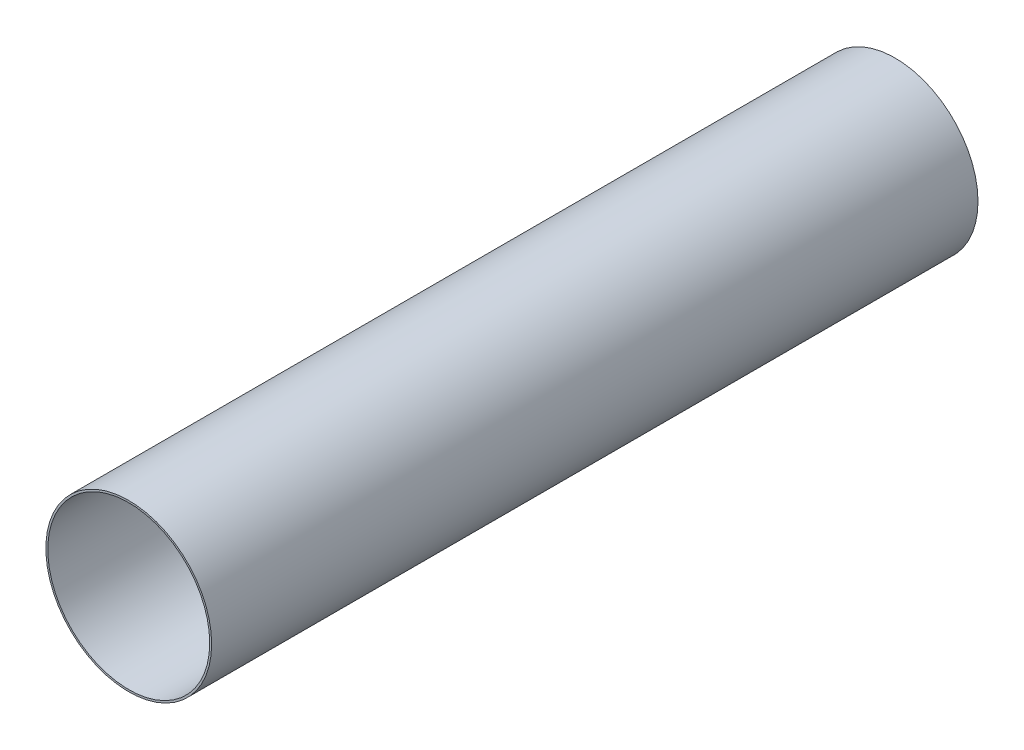
ISO-10303-21;
HEADER;
FILE_DESCRIPTION(('STEP AP214'),'2;1');
FILE_NAME('part.step','',(''),(''),'','','');
FILE_SCHEMA(('AUTOMOTIVE_DESIGN { 1 0 10303 214 1 1 1 1 }'));
ENDSEC;
DATA;
#1=APPLICATION_CONTEXT('core data for automotive mechanical design processes');
#2=APPLICATION_PROTOCOL_DEFINITION('international standard','automotive_design',2000,#1);
#3=PRODUCT_CONTEXT('',#1,'mechanical');
#4=PRODUCT('Part','Part','',(#3));
#5=PRODUCT_RELATED_PRODUCT_CATEGORY('part','',(#4));
#6=PRODUCT_DEFINITION_FORMATION('','',#4);
#7=PRODUCT_DEFINITION_CONTEXT('part definition',#1,'design');
#8=PRODUCT_DEFINITION('design','',#6,#7);
#9=PRODUCT_DEFINITION_SHAPE('','',#8);
#10=(LENGTH_UNIT() NAMED_UNIT(*) SI_UNIT(.MILLI.,.METRE.));
#11=(NAMED_UNIT(*) PLANE_ANGLE_UNIT() SI_UNIT($,.RADIAN.));
#12=(NAMED_UNIT(*) SI_UNIT($,.STERADIAN.) SOLID_ANGLE_UNIT());
#13=UNCERTAINTY_MEASURE_WITH_UNIT(LENGTH_MEASURE(1.E-05),#10,'distance_accuracy_value','');
#14=(GEOMETRIC_REPRESENTATION_CONTEXT(3) GLOBAL_UNCERTAINTY_ASSIGNED_CONTEXT((#13)) GLOBAL_UNIT_ASSIGNED_CONTEXT((#10,
#11,#12)) REPRESENTATION_CONTEXT('',''));
#15=CARTESIAN_POINT('',(0.,0.,0.));
#16=DIRECTION('',(0.,0.,1.));
#17=DIRECTION('',(1.,0.,0.));
#18=AXIS2_PLACEMENT_3D('',#15,#16,#17);
#19=CARTESIAN_POINT('',(0.,0.,762.));
#20=DIRECTION('',(0.,0.,1.));
#21=DIRECTION('',(1.,0.,0.));
#22=AXIS2_PLACEMENT_3D('',#19,#20,#21);
#23=PLANE('',#22);
#24=CARTESIAN_POINT('',(0.,0.,762.));
#25=DIRECTION('',(0.,0.,1.));
#26=DIRECTION('',(1.,0.,0.));
#27=AXIS2_PLACEMENT_3D('',#24,#25,#26);
#28=CIRCLE('',#27,82.42808);
#29=CARTESIAN_POINT('',(82.42808,0.,762.));
#30=VERTEX_POINT('',#29);
#31=EDGE_CURVE('E10',#30,#30,#28,.T.);
#32=ORIENTED_EDGE('',*,*,#31,.T.);
#33=EDGE_LOOP('',(#32));
#34=FACE_BOUND('',#33,.T.);
#35=CARTESIAN_POINT('',(0.,0.,762.));
#36=DIRECTION('',(0.,0.,1.));
#37=DIRECTION('',(1.,0.,0.));
#38=AXIS2_PLACEMENT_3D('',#35,#36,#37);
#39=CIRCLE('',#38,80.518);
#40=CARTESIAN_POINT('',(80.518,0.,762.));
#41=VERTEX_POINT('',#40);
#42=EDGE_CURVE('E48',#41,#41,#39,.T.);
#43=ORIENTED_EDGE('',*,*,#42,.F.);
#44=EDGE_LOOP('',(#43));
#45=FACE_BOUND('',#44,.T.);
#46=ADVANCED_FACE('F37',(#34,#45),#23,.T.);
#47=CARTESIAN_POINT('',(0.,0.,0.));
#48=DIRECTION('',(0.,0.,1.));
#49=DIRECTION('',(1.,0.,0.));
#50=AXIS2_PLACEMENT_3D('',#47,#48,#49);
#51=PLANE('',#50);
#52=CARTESIAN_POINT('',(0.,0.,0.));
#53=DIRECTION('',(0.,0.,1.));
#54=DIRECTION('',(1.,0.,0.));
#55=AXIS2_PLACEMENT_3D('',#52,#53,#54);
#56=CIRCLE('',#55,82.42808);
#57=CARTESIAN_POINT('',(82.42808,0.,0.));
#58=VERTEX_POINT('',#57);
#59=EDGE_CURVE('E41',#58,#58,#56,.T.);
#60=ORIENTED_EDGE('',*,*,#59,.F.);
#61=EDGE_LOOP('',(#60));
#62=FACE_BOUND('',#61,.T.);
#63=CARTESIAN_POINT('',(0.,0.,0.));
#64=DIRECTION('',(0.,0.,1.));
#65=DIRECTION('',(1.,0.,0.));
#66=AXIS2_PLACEMENT_3D('',#63,#64,#65);
#67=CIRCLE('',#66,80.518);
#68=CARTESIAN_POINT('',(80.518,0.,0.));
#69=VERTEX_POINT('',#68);
#70=EDGE_CURVE('E50',#69,#69,#67,.T.);
#71=ORIENTED_EDGE('',*,*,#70,.T.);
#72=EDGE_LOOP('',(#71));
#73=FACE_BOUND('',#72,.T.);
#74=ADVANCED_FACE('F60',(#62,#73),#51,.F.);
#75=CARTESIAN_POINT('',(0.,0.,762.));
#76=DIRECTION('',(0.,0.,-1.));
#77=DIRECTION('',(-1.,0.,0.));
#78=AXIS2_PLACEMENT_3D('',#75,#76,#77);
#79=CYLINDRICAL_SURFACE('',#78,82.42808);
#80=ORIENTED_EDGE('',*,*,#31,.F.);
#81=EDGE_LOOP('',(#80));
#82=FACE_BOUND('',#81,.T.);
#83=ORIENTED_EDGE('',*,*,#59,.T.);
#84=EDGE_LOOP('',(#83));
#85=FACE_BOUND('',#84,.T.);
#86=ADVANCED_FACE('F39',(#82,#85),#79,.T.);
#87=CARTESIAN_POINT('',(0.,0.,762.));
#88=DIRECTION('',(0.,0.,-1.));
#89=DIRECTION('',(-1.,0.,0.));
#90=AXIS2_PLACEMENT_3D('',#87,#88,#89);
#91=CYLINDRICAL_SURFACE('',#90,80.518);
#92=ORIENTED_EDGE('',*,*,#42,.T.);
#93=EDGE_LOOP('',(#92));
#94=FACE_BOUND('',#93,.T.);
#95=ORIENTED_EDGE('',*,*,#70,.F.);
#96=EDGE_LOOP('',(#95));
#97=FACE_BOUND('',#96,.T.);
#98=ADVANCED_FACE('F56',(#94,#97),#91,.F.);
#99=CLOSED_SHELL('',(#46,#74,#86,#98));
#100=MANIFOLD_SOLID_BREP('B2',#99);
#101=ADVANCED_BREP_SHAPE_REPRESENTATION('',(#18,#100),#14);
#102=SHAPE_DEFINITION_REPRESENTATION(#9,#101);
ENDSEC;
END-ISO-10303-21;
